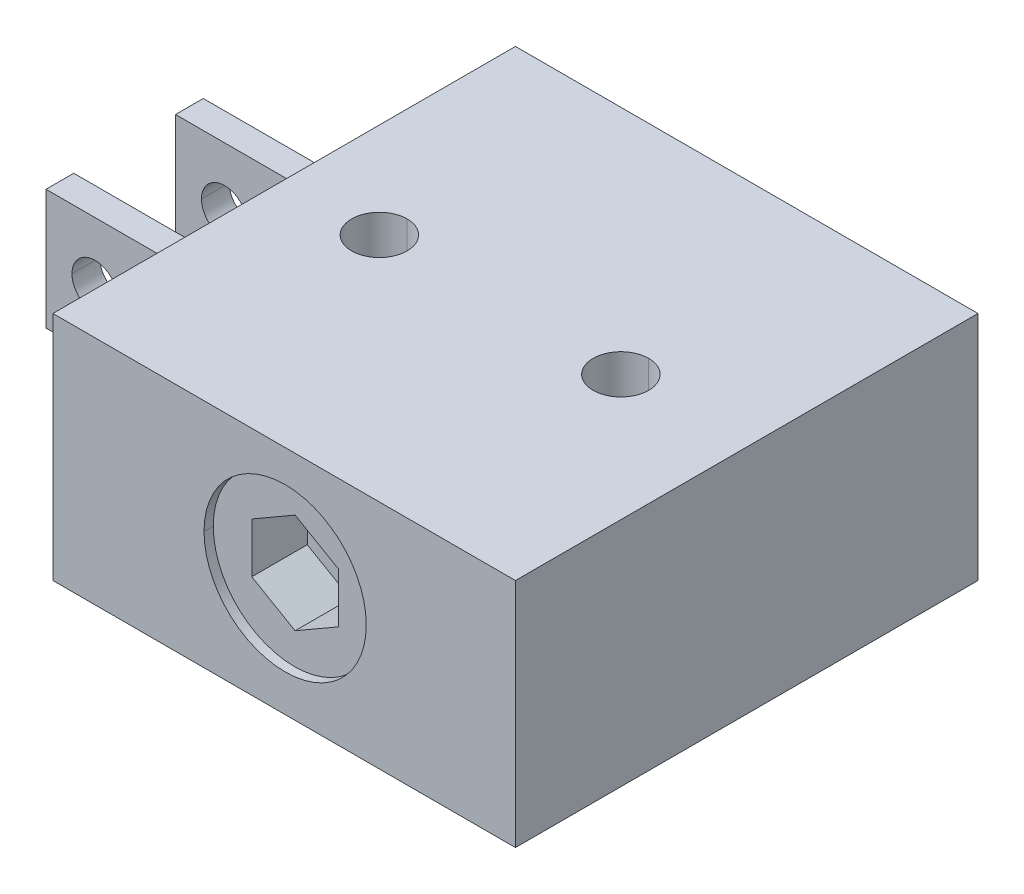
ISO-10303-21;
HEADER;
FILE_DESCRIPTION(('STEP AP214'),'2;1');
FILE_NAME('part.step','',(''),(''),'','','');
FILE_SCHEMA(('AUTOMOTIVE_DESIGN { 1 0 10303 214 1 1 1 1 }'));
ENDSEC;
DATA;
#1=APPLICATION_CONTEXT('core data for automotive mechanical design processes');
#2=APPLICATION_PROTOCOL_DEFINITION('international standard','automotive_design',2000,#1);
#3=PRODUCT_CONTEXT('',#1,'mechanical');
#4=PRODUCT('Part','Part','',(#3));
#5=PRODUCT_RELATED_PRODUCT_CATEGORY('part','',(#4));
#6=PRODUCT_DEFINITION_FORMATION('','',#4);
#7=PRODUCT_DEFINITION_CONTEXT('part definition',#1,'design');
#8=PRODUCT_DEFINITION('design','',#6,#7);
#9=PRODUCT_DEFINITION_SHAPE('','',#8);
#10=(LENGTH_UNIT() NAMED_UNIT(*) SI_UNIT(.MILLI.,.METRE.));
#11=(NAMED_UNIT(*) PLANE_ANGLE_UNIT() SI_UNIT($,.RADIAN.));
#12=(NAMED_UNIT(*) SI_UNIT($,.STERADIAN.) SOLID_ANGLE_UNIT());
#13=UNCERTAINTY_MEASURE_WITH_UNIT(LENGTH_MEASURE(1.E-05),#10,'distance_accuracy_value','');
#14=(GEOMETRIC_REPRESENTATION_CONTEXT(3) GLOBAL_UNCERTAINTY_ASSIGNED_CONTEXT((#13)) GLOBAL_UNIT_ASSIGNED_CONTEXT((#10,
#11,#12)) REPRESENTATION_CONTEXT('',''));
#15=CARTESIAN_POINT('',(0.,0.,0.));
#16=DIRECTION('',(0.,0.,1.));
#17=DIRECTION('',(1.,0.,0.));
#18=AXIS2_PLACEMENT_3D('',#15,#16,#17);
#19=CARTESIAN_POINT('',(-15.0142160341164,6.35,6.35));
#20=DIRECTION('',(0.,1.,0.));
#21=DIRECTION('',(0.,0.,1.));
#22=AXIS2_PLACEMENT_3D('',#19,#20,#21);
#23=CYLINDRICAL_SURFACE('',#22,0.762);
#24=DIRECTION('',(0.,1.,0.));
#25=VECTOR('',#24,1.);
#26=CARTESIAN_POINT('',(-15.0142160341164,6.35,5.588));
#27=LINE('',#26,#25);
#28=CARTESIAN_POINT('',(-15.0142160341164,6.35,5.588));
#29=VERTEX_POINT('',#28);
#30=CARTESIAN_POINT('',(-15.0142160341164,12.7,5.588));
#31=VERTEX_POINT('',#30);
#32=EDGE_CURVE('E337',#29,#31,#27,.T.);
#33=ORIENTED_EDGE('',*,*,#32,.F.);
#34=CARTESIAN_POINT('',(-15.0142160341164,6.35,6.35));
#35=DIRECTION('',(0.,1.,0.));
#36=DIRECTION('',(0.,0.,1.));
#37=AXIS2_PLACEMENT_3D('',#34,#35,#36);
#38=CIRCLE('',#37,0.762);
#39=CARTESIAN_POINT('',(-15.0142160341164,6.35,7.112));
#40=VERTEX_POINT('',#39);
#41=EDGE_CURVE('E413',#40,#29,#38,.T.);
#42=ORIENTED_EDGE('',*,*,#41,.F.);
#43=DIRECTION('',(0.,1.,0.));
#44=VECTOR('',#43,1.);
#45=CARTESIAN_POINT('',(-15.0142160341164,6.35,7.112));
#46=LINE('',#45,#44);
#47=CARTESIAN_POINT('',(-15.0142160341164,12.7,7.112));
#48=VERTEX_POINT('',#47);
#49=EDGE_CURVE('E359',#40,#48,#46,.T.);
#50=ORIENTED_EDGE('',*,*,#49,.T.);
#51=CARTESIAN_POINT('',(-15.0142160341164,12.7,6.35));
#52=DIRECTION('',(0.,1.,0.));
#53=DIRECTION('',(0.,0.,1.));
#54=AXIS2_PLACEMENT_3D('',#51,#52,#53);
#55=CIRCLE('',#54,0.762);
#56=EDGE_CURVE('E115',#48,#31,#55,.T.);
#57=ORIENTED_EDGE('',*,*,#56,.T.);
#58=EDGE_LOOP('',(#33,#42,#50,#57));
#59=FACE_BOUND('',#58,.T.);
#60=ADVANCED_FACE('F16',(#59),#23,.F.);
#61=CARTESIAN_POINT('',(-8.38332504879147,6.35,6.35));
#62=DIRECTION('',(0.,1.,0.));
#63=DIRECTION('',(0.,0.,1.));
#64=AXIS2_PLACEMENT_3D('',#61,#62,#63);
#65=CYLINDRICAL_SURFACE('',#64,0.762);
#66=DIRECTION('',(0.,1.,0.));
#67=VECTOR('',#66,1.);
#68=CARTESIAN_POINT('',(-8.38332504879147,6.35,5.588));
#69=LINE('',#68,#67);
#70=CARTESIAN_POINT('',(-8.38332504879147,6.35,5.588));
#71=VERTEX_POINT('',#70);
#72=CARTESIAN_POINT('',(-8.38332504879147,12.7,5.588));
#73=VERTEX_POINT('',#72);
#74=EDGE_CURVE('E371',#71,#73,#69,.T.);
#75=ORIENTED_EDGE('',*,*,#74,.F.);
#76=CARTESIAN_POINT('',(-8.38332504879147,6.35,6.35));
#77=DIRECTION('',(0.,1.,0.));
#78=DIRECTION('',(0.,0.,1.));
#79=AXIS2_PLACEMENT_3D('',#76,#77,#78);
#80=CIRCLE('',#79,0.762);
#81=CARTESIAN_POINT('',(-8.38332504879147,6.35,7.112));
#82=VERTEX_POINT('',#81);
#83=EDGE_CURVE('E99',#82,#71,#80,.T.);
#84=ORIENTED_EDGE('',*,*,#83,.F.);
#85=DIRECTION('',(0.,1.,0.));
#86=VECTOR('',#85,1.);
#87=CARTESIAN_POINT('',(-8.38332504879147,6.35,7.112));
#88=LINE('',#87,#86);
#89=CARTESIAN_POINT('',(-8.38332504879147,12.7,7.112));
#90=VERTEX_POINT('',#89);
#91=EDGE_CURVE('E307',#82,#90,#88,.T.);
#92=ORIENTED_EDGE('',*,*,#91,.T.);
#93=CARTESIAN_POINT('',(-8.38332504879147,12.7,6.35));
#94=DIRECTION('',(0.,1.,0.));
#95=DIRECTION('',(0.,0.,1.));
#96=AXIS2_PLACEMENT_3D('',#93,#94,#95);
#97=CIRCLE('',#96,0.762);
#98=EDGE_CURVE('E354',#90,#73,#97,.T.);
#99=ORIENTED_EDGE('',*,*,#98,.T.);
#100=EDGE_LOOP('',(#75,#84,#92,#99));
#101=FACE_BOUND('',#100,.T.);
#102=ADVANCED_FACE('F946',(#101),#65,.F.);
#103=CARTESIAN_POINT('',(-10.0410788200446,10.2899936535945,10.922));
#104=DIRECTION('',(0.5,0.866025403784438,0.));
#105=DIRECTION('',(0.,0.,-1.));
#106=AXIS2_PLACEMENT_3D('',#103,#104,#105);
#107=PLANE('',#106);
#108=DIRECTION('',(0.866025403784438,-0.5,0.));
#109=VECTOR('',#108,1.);
#110=CARTESIAN_POINT('',(-10.0410788200446,10.2899936535945,12.446));
#111=LINE('',#110,#109);
#112=CARTESIAN_POINT('',(-11.2317038200446,10.9774013178484,12.446));
#113=VERTEX_POINT('',#112);
#114=CARTESIAN_POINT('',(-10.0410788200446,10.2899936535945,12.446));
#115=VERTEX_POINT('',#114);
#116=EDGE_CURVE('E294',#113,#115,#111,.T.);
#117=ORIENTED_EDGE('',*,*,#116,.F.);
#118=DIRECTION('',(0.,0.,1.));
#119=VECTOR('',#118,1.);
#120=CARTESIAN_POINT('',(-11.2317038200446,10.9774013178484,10.922));
#121=LINE('',#120,#119);
#122=CARTESIAN_POINT('',(-11.2317038200446,10.9774013178484,10.922));
#123=VERTEX_POINT('',#122);
#124=EDGE_CURVE('E344',#123,#113,#121,.T.);
#125=ORIENTED_EDGE('',*,*,#124,.F.);
#126=DIRECTION('',(-0.866025403784438,0.5,0.));
#127=VECTOR('',#126,1.);
#128=CARTESIAN_POINT('',(-10.0410788200446,10.2899936535945,10.922));
#129=LINE('',#128,#127);
#130=CARTESIAN_POINT('',(-10.0410788200446,10.2899936535945,10.922));
#131=VERTEX_POINT('',#130);
#132=EDGE_CURVE('E332',#131,#123,#129,.T.);
#133=ORIENTED_EDGE('',*,*,#132,.F.);
#134=DIRECTION('',(0.,0.,1.));
#135=VECTOR('',#134,1.);
#136=CARTESIAN_POINT('',(-10.0410788200446,10.2899936535945,10.922));
#137=LINE('',#136,#135);
#138=EDGE_CURVE('E11',#131,#115,#137,.T.);
#139=ORIENTED_EDGE('',*,*,#138,.T.);
#140=EDGE_LOOP('',(#117,#125,#133,#139));
#141=FACE_BOUND('',#140,.T.);
#142=ADVANCED_FACE('F950',(#141),#107,.F.);
#143=CARTESIAN_POINT('',(-10.0410788200446,8.91517832508675,10.922));
#144=DIRECTION('',(1.,0.,0.));
#145=DIRECTION('',(0.,1.,0.));
#146=AXIS2_PLACEMENT_3D('',#143,#144,#145);
#147=PLANE('',#146);
#148=DIRECTION('',(0.,-1.,0.));
#149=VECTOR('',#148,1.);
#150=CARTESIAN_POINT('',(-10.0410788200446,8.91517832508675,12.446));
#151=LINE('',#150,#149);
#152=CARTESIAN_POINT('',(-10.0410788200446,8.91517832508675,12.446));
#153=VERTEX_POINT('',#152);
#154=EDGE_CURVE('E427',#115,#153,#151,.T.);
#155=ORIENTED_EDGE('',*,*,#154,.F.);
#156=ORIENTED_EDGE('',*,*,#138,.F.);
#157=DIRECTION('',(0.,1.,0.));
#158=VECTOR('',#157,1.);
#159=CARTESIAN_POINT('',(-10.0410788200446,8.91517832508675,10.922));
#160=LINE('',#159,#158);
#161=CARTESIAN_POINT('',(-10.0410788200446,8.91517832508675,10.922));
#162=VERTEX_POINT('',#161);
#163=EDGE_CURVE('E20',#162,#131,#160,.T.);
#164=ORIENTED_EDGE('',*,*,#163,.F.);
#165=DIRECTION('',(0.,0.,1.));
#166=VECTOR('',#165,1.);
#167=CARTESIAN_POINT('',(-10.0410788200446,8.91517832508675,10.922));
#168=LINE('',#167,#166);
#169=EDGE_CURVE('E27',#162,#153,#168,.T.);
#170=ORIENTED_EDGE('',*,*,#169,.T.);
#171=EDGE_LOOP('',(#155,#156,#164,#170));
#172=FACE_BOUND('',#171,.T.);
#173=ADVANCED_FACE('F875',(#172),#147,.F.);
#174=CARTESIAN_POINT('',(-11.2317038200446,8.22777066083285,10.922));
#175=DIRECTION('',(0.5,-0.866025403784439,0.));
#176=DIRECTION('',(0.,0.,-1.));
#177=AXIS2_PLACEMENT_3D('',#174,#175,#176);
#178=PLANE('',#177);
#179=DIRECTION('',(-0.866025403784438,-0.5,0.));
#180=VECTOR('',#179,1.);
#181=CARTESIAN_POINT('',(-11.2317038200446,8.22777066083285,12.446));
#182=LINE('',#181,#180);
#183=CARTESIAN_POINT('',(-11.2317038200446,8.22777066083285,12.446));
#184=VERTEX_POINT('',#183);
#185=EDGE_CURVE('E382',#153,#184,#182,.T.);
#186=ORIENTED_EDGE('',*,*,#185,.F.);
#187=ORIENTED_EDGE('',*,*,#169,.F.);
#188=DIRECTION('',(0.866025403784439,0.5,0.));
#189=VECTOR('',#188,1.);
#190=CARTESIAN_POINT('',(-11.2317038200446,8.22777066083285,10.922));
#191=LINE('',#190,#189);
#192=CARTESIAN_POINT('',(-11.2317038200446,8.22777066083285,10.922));
#193=VERTEX_POINT('',#192);
#194=EDGE_CURVE('E456',#193,#162,#191,.T.);
#195=ORIENTED_EDGE('',*,*,#194,.F.);
#196=DIRECTION('',(0.,0.,1.));
#197=VECTOR('',#196,1.);
#198=CARTESIAN_POINT('',(-11.2317038200446,8.22777066083285,10.922));
#199=LINE('',#198,#197);
#200=EDGE_CURVE('E493',#193,#184,#199,.T.);
#201=ORIENTED_EDGE('',*,*,#200,.T.);
#202=EDGE_LOOP('',(#186,#187,#195,#201));
#203=FACE_BOUND('',#202,.T.);
#204=ADVANCED_FACE('F870',(#203),#178,.F.);
#205=CARTESIAN_POINT('',(-12.4223288200446,8.91517832508675,10.922));
#206=DIRECTION('',(-0.5,-0.866025403784439,0.));
#207=DIRECTION('',(-0.866025403784439,0.5,0.));
#208=AXIS2_PLACEMENT_3D('',#205,#206,#207);
#209=PLANE('',#208);
#210=DIRECTION('',(-0.866025403784439,0.5,0.));
#211=VECTOR('',#210,1.);
#212=CARTESIAN_POINT('',(-12.4223288200446,8.91517832508675,12.446));
#213=LINE('',#212,#211);
#214=CARTESIAN_POINT('',(-12.4223288200446,8.91517832508675,12.446));
#215=VERTEX_POINT('',#214);
#216=EDGE_CURVE('E469',#184,#215,#213,.T.);
#217=ORIENTED_EDGE('',*,*,#216,.F.);
#218=ORIENTED_EDGE('',*,*,#200,.F.);
#219=DIRECTION('',(0.866025403784439,-0.5,0.));
#220=VECTOR('',#219,1.);
#221=CARTESIAN_POINT('',(-12.4223288200446,8.91517832508675,10.922));
#222=LINE('',#221,#220);
#223=CARTESIAN_POINT('',(-12.4223288200446,8.91517832508675,10.922));
#224=VERTEX_POINT('',#223);
#225=EDGE_CURVE('E452',#224,#193,#222,.T.);
#226=ORIENTED_EDGE('',*,*,#225,.F.);
#227=DIRECTION('',(0.,0.,1.));
#228=VECTOR('',#227,1.);
#229=CARTESIAN_POINT('',(-12.4223288200446,8.91517832508675,10.922));
#230=LINE('',#229,#228);
#231=EDGE_CURVE('E489',#224,#215,#230,.T.);
#232=ORIENTED_EDGE('',*,*,#231,.T.);
#233=EDGE_LOOP('',(#217,#218,#226,#232));
#234=FACE_BOUND('',#233,.T.);
#235=ADVANCED_FACE('F874',(#234),#209,.F.);
#236=CARTESIAN_POINT('',(-12.4223288200446,10.2899936535945,10.922));
#237=DIRECTION('',(-1.,0.,0.));
#238=DIRECTION('',(0.,0.,1.));
#239=AXIS2_PLACEMENT_3D('',#236,#237,#238);
#240=PLANE('',#239);
#241=DIRECTION('',(0.,1.,0.));
#242=VECTOR('',#241,1.);
#243=CARTESIAN_POINT('',(-12.4223288200446,10.2899936535945,12.446));
#244=LINE('',#243,#242);
#245=CARTESIAN_POINT('',(-12.4223288200446,10.2899936535945,12.446));
#246=VERTEX_POINT('',#245);
#247=EDGE_CURVE('E387',#215,#246,#244,.T.);
#248=ORIENTED_EDGE('',*,*,#247,.F.);
#249=ORIENTED_EDGE('',*,*,#231,.F.);
#250=DIRECTION('',(0.,-1.,0.));
#251=VECTOR('',#250,1.);
#252=CARTESIAN_POINT('',(-12.4223288200446,10.2899936535945,10.922));
#253=LINE('',#252,#251);
#254=CARTESIAN_POINT('',(-12.4223288200446,10.2899936535945,10.922));
#255=VERTEX_POINT('',#254);
#256=EDGE_CURVE('E331',#255,#224,#253,.T.);
#257=ORIENTED_EDGE('',*,*,#256,.F.);
#258=DIRECTION('',(0.,0.,1.));
#259=VECTOR('',#258,1.);
#260=CARTESIAN_POINT('',(-12.4223288200446,10.2899936535945,10.922));
#261=LINE('',#260,#259);
#262=EDGE_CURVE('E341',#255,#246,#261,.T.);
#263=ORIENTED_EDGE('',*,*,#262,.T.);
#264=EDGE_LOOP('',(#248,#249,#257,#263));
#265=FACE_BOUND('',#264,.T.);
#266=ADVANCED_FACE('F933',(#265),#240,.F.);
#267=CARTESIAN_POINT('',(-11.2317038200446,10.9774013178484,10.922));
#268=DIRECTION('',(-0.5,0.866025403784439,0.));
#269=DIRECTION('',(0.,0.,1.));
#270=AXIS2_PLACEMENT_3D('',#267,#268,#269);
#271=PLANE('',#270);
#272=DIRECTION('',(0.866025403784439,0.5,0.));
#273=VECTOR('',#272,1.);
#274=CARTESIAN_POINT('',(-11.2317038200446,10.9774013178484,12.446));
#275=LINE('',#274,#273);
#276=EDGE_CURVE('E384',#246,#113,#275,.T.);
#277=ORIENTED_EDGE('',*,*,#276,.F.);
#278=ORIENTED_EDGE('',*,*,#262,.F.);
#279=DIRECTION('',(-0.866025403784439,-0.5,0.));
#280=VECTOR('',#279,1.);
#281=CARTESIAN_POINT('',(-11.2317038200446,10.9774013178484,10.922));
#282=LINE('',#281,#280);
#283=EDGE_CURVE('E327',#123,#255,#282,.T.);
#284=ORIENTED_EDGE('',*,*,#283,.F.);
#285=ORIENTED_EDGE('',*,*,#124,.T.);
#286=EDGE_LOOP('',(#277,#278,#284,#285));
#287=FACE_BOUND('',#286,.T.);
#288=ADVANCED_FACE('F937',(#287),#271,.F.);
#289=CARTESIAN_POINT('',(0.,0.,10.922));
#290=DIRECTION('',(0.,0.,1.));
#291=DIRECTION('',(1.,0.,0.));
#292=AXIS2_PLACEMENT_3D('',#289,#290,#291);
#293=PLANE('',#292);
#294=ORIENTED_EDGE('',*,*,#132,.T.);
#295=ORIENTED_EDGE('',*,*,#283,.T.);
#296=ORIENTED_EDGE('',*,*,#256,.T.);
#297=ORIENTED_EDGE('',*,*,#225,.T.);
#298=ORIENTED_EDGE('',*,*,#194,.T.);
#299=ORIENTED_EDGE('',*,*,#163,.T.);
#300=EDGE_LOOP('',(#294,#295,#296,#297,#298,#299));
#301=FACE_BOUND('',#300,.T.);
#302=ADVANCED_FACE('F973',(#301),#293,.T.);
#303=CARTESIAN_POINT('',(-11.2518609609383,9.59255609938031,12.446));
#304=DIRECTION('',(0.,0.,1.));
#305=DIRECTION('',(1.,0.,0.));
#306=AXIS2_PLACEMENT_3D('',#303,#304,#305);
#307=CYLINDRICAL_SURFACE('',#306,2.22699398855566);
#308=DIRECTION('',(0.,0.,1.));
#309=VECTOR('',#308,1.);
#310=CARTESIAN_POINT('',(-13.478854949494,9.59255609938031,12.446));
#311=LINE('',#310,#309);
#312=CARTESIAN_POINT('',(-13.478854949494,9.59255609938031,12.446));
#313=VERTEX_POINT('',#312);
#314=CARTESIAN_POINT('',(-13.478854949494,9.59255609938031,12.7));
#315=VERTEX_POINT('',#314);
#316=EDGE_CURVE('E289',#313,#315,#311,.T.);
#317=ORIENTED_EDGE('',*,*,#316,.F.);
#318=CARTESIAN_POINT('',(-11.2518609609383,9.59255609938031,12.446));
#319=DIRECTION('',(0.,0.,1.));
#320=DIRECTION('',(1.,0.,0.));
#321=AXIS2_PLACEMENT_3D('',#318,#319,#320);
#322=CIRCLE('',#321,2.22699398855566);
#323=CARTESIAN_POINT('',(-9.02486697238265,9.59255609938031,12.446));
#324=VERTEX_POINT('',#323);
#325=EDGE_CURVE('E283',#324,#313,#322,.T.);
#326=ORIENTED_EDGE('',*,*,#325,.F.);
#327=DIRECTION('',(0.,0.,1.));
#328=VECTOR('',#327,1.);
#329=CARTESIAN_POINT('',(-9.02486697238265,9.59255609938031,12.446));
#330=LINE('',#329,#328);
#331=CARTESIAN_POINT('',(-9.02486697238265,9.59255609938031,12.7));
#332=VERTEX_POINT('',#331);
#333=EDGE_CURVE('E286',#324,#332,#330,.T.);
#334=ORIENTED_EDGE('',*,*,#333,.T.);
#335=CARTESIAN_POINT('',(-11.2518609609383,9.59255609938031,12.7));
#336=DIRECTION('',(0.,0.,1.));
#337=DIRECTION('',(1.,0.,0.));
#338=AXIS2_PLACEMENT_3D('',#335,#336,#337);
#339=CIRCLE('',#338,2.22699398855566);
#340=EDGE_CURVE('E350',#332,#315,#339,.T.);
#341=ORIENTED_EDGE('',*,*,#340,.T.);
#342=EDGE_LOOP('',(#317,#326,#334,#341));
#343=FACE_BOUND('',#342,.T.);
#344=ADVANCED_FACE('F285',(#343),#307,.F.);
#345=CARTESIAN_POINT('',(-11.2518609609383,9.59255609938031,12.446));
#346=DIRECTION('',(0.,0.,1.));
#347=DIRECTION('',(1.,0.,0.));
#348=AXIS2_PLACEMENT_3D('',#345,#346,#347);
#349=PLANE('',#348);
#350=ORIENTED_EDGE('',*,*,#116,.T.);
#351=ORIENTED_EDGE('',*,*,#154,.T.);
#352=ORIENTED_EDGE('',*,*,#185,.T.);
#353=ORIENTED_EDGE('',*,*,#216,.T.);
#354=ORIENTED_EDGE('',*,*,#247,.T.);
#355=ORIENTED_EDGE('',*,*,#276,.T.);
#356=EDGE_LOOP('',(#350,#351,#352,#353,#354,#355));
#357=FACE_BOUND('',#356,.T.);
#358=ORIENTED_EDGE('',*,*,#325,.T.);
#359=CARTESIAN_POINT('',(-11.2518609609383,9.59255609938031,12.446));
#360=DIRECTION('',(0.,0.,1.));
#361=DIRECTION('',(1.,0.,0.));
#362=AXIS2_PLACEMENT_3D('',#359,#360,#361);
#363=CIRCLE('',#362,2.22699398855566);
#364=EDGE_CURVE('E299',#313,#324,#363,.T.);
#365=ORIENTED_EDGE('',*,*,#364,.T.);
#366=EDGE_LOOP('',(#358,#365));
#367=FACE_BOUND('',#366,.T.);
#368=ADVANCED_FACE('F305',(#357,#367),#349,.T.);
#369=CARTESIAN_POINT('',(-20.8526450796778,9.525,0.));
#370=DIRECTION('',(0.,0.,1.));
#371=DIRECTION('',(1.,0.,0.));
#372=AXIS2_PLACEMENT_3D('',#369,#370,#371);
#373=CYLINDRICAL_SURFACE('',#372,0.635);
#374=DIRECTION('',(0.,0.,1.));
#375=VECTOR('',#374,1.);
#376=CARTESIAN_POINT('',(-21.4876450796779,9.525,0.));
#377=LINE('',#376,#375);
#378=CARTESIAN_POINT('',(-21.4876450796779,9.525,3.99919577824115));
#379=VERTEX_POINT('',#378);
#380=CARTESIAN_POINT('',(-21.4876450796779,9.525,4.76119577824115));
#381=VERTEX_POINT('',#380);
#382=EDGE_CURVE('E441',#379,#381,#377,.T.);
#383=ORIENTED_EDGE('',*,*,#382,.F.);
#384=CARTESIAN_POINT('',(-20.8526450796778,9.525,3.99919577824115));
#385=DIRECTION('',(0.,0.,1.));
#386=DIRECTION('',(1.,0.,0.));
#387=AXIS2_PLACEMENT_3D('',#384,#385,#386);
#388=CIRCLE('',#387,0.635);
#389=CARTESIAN_POINT('',(-20.2176450796779,9.525,3.99919577824115));
#390=VERTEX_POINT('',#389);
#391=EDGE_CURVE('E325',#390,#379,#388,.T.);
#392=ORIENTED_EDGE('',*,*,#391,.F.);
#393=DIRECTION('',(0.,0.,1.));
#394=VECTOR('',#393,1.);
#395=CARTESIAN_POINT('',(-20.2176450796779,9.525,0.));
#396=LINE('',#395,#394);
#397=CARTESIAN_POINT('',(-20.2176450796779,9.525,4.76119577824115));
#398=VERTEX_POINT('',#397);
#399=EDGE_CURVE('E473',#390,#398,#396,.T.);
#400=ORIENTED_EDGE('',*,*,#399,.T.);
#401=CARTESIAN_POINT('',(-20.8526450796778,9.525,4.76119577824115));
#402=DIRECTION('',(0.,0.,-1.));
#403=DIRECTION('',(0.,1.,0.));
#404=AXIS2_PLACEMENT_3D('',#401,#402,#403);
#405=CIRCLE('',#404,0.635);
#406=EDGE_CURVE('E401',#381,#398,#405,.T.);
#407=ORIENTED_EDGE('',*,*,#406,.F.);
#408=EDGE_LOOP('',(#383,#392,#400,#407));
#409=FACE_BOUND('',#408,.T.);
#410=ADVANCED_FACE('F1102',(#409),#373,.F.);
#411=CARTESIAN_POINT('',(-20.8526450796778,9.525,0.));
#412=DIRECTION('',(0.,0.,1.));
#413=DIRECTION('',(1.,0.,0.));
#414=AXIS2_PLACEMENT_3D('',#411,#412,#413);
#415=CYLINDRICAL_SURFACE('',#414,0.635);
#416=DIRECTION('',(0.,0.,1.));
#417=VECTOR('',#416,1.);
#418=CARTESIAN_POINT('',(-21.4876450796779,9.525,0.));
#419=LINE('',#418,#417);
#420=CARTESIAN_POINT('',(-21.4876450796779,9.525,7.55519577824115));
#421=VERTEX_POINT('',#420);
#422=CARTESIAN_POINT('',(-21.4876450796779,9.525,8.31719577824115));
#423=VERTEX_POINT('',#422);
#424=EDGE_CURVE('E403',#421,#423,#419,.T.);
#425=ORIENTED_EDGE('',*,*,#424,.F.);
#426=CARTESIAN_POINT('',(-20.8526450796778,9.525,7.55519577824115));
#427=DIRECTION('',(0.,0.,1.));
#428=DIRECTION('',(1.,0.,0.));
#429=AXIS2_PLACEMENT_3D('',#426,#427,#428);
#430=CIRCLE('',#429,0.635);
#431=CARTESIAN_POINT('',(-20.2176450796779,9.525,7.55519577824115));
#432=VERTEX_POINT('',#431);
#433=EDGE_CURVE('E156',#432,#421,#430,.T.);
#434=ORIENTED_EDGE('',*,*,#433,.F.);
#435=DIRECTION('',(0.,0.,1.));
#436=VECTOR('',#435,1.);
#437=CARTESIAN_POINT('',(-20.2176450796779,9.525,0.));
#438=LINE('',#437,#436);
#439=CARTESIAN_POINT('',(-20.2176450796779,9.525,8.31719577824115));
#440=VERTEX_POINT('',#439);
#441=EDGE_CURVE('E393',#432,#440,#438,.T.);
#442=ORIENTED_EDGE('',*,*,#441,.T.);
#443=CARTESIAN_POINT('',(-20.8526450796778,9.525,8.31719577824115));
#444=DIRECTION('',(0.,0.,-1.));
#445=DIRECTION('',(0.,1.,0.));
#446=AXIS2_PLACEMENT_3D('',#443,#444,#445);
#447=CIRCLE('',#446,0.635);
#448=EDGE_CURVE('E145',#423,#440,#447,.T.);
#449=ORIENTED_EDGE('',*,*,#448,.F.);
#450=EDGE_LOOP('',(#425,#434,#442,#449));
#451=FACE_BOUND('',#450,.T.);
#452=ADVANCED_FACE('F924',(#451),#415,.F.);
#453=CARTESIAN_POINT('',(-22.2003582089552,0.,0.));
#454=DIRECTION('',(-1.,0.,0.));
#455=DIRECTION('',(0.,0.,1.));
#456=AXIS2_PLACEMENT_3D('',#453,#454,#455);
#457=PLANE('',#456);
#458=DIRECTION('',(0.,-1.,0.));
#459=VECTOR('',#458,1.);
#460=CARTESIAN_POINT('',(-22.2003582089552,11.176,7.55519577824115));
#461=LINE('',#460,#459);
#462=CARTESIAN_POINT('',(-22.2003582089552,11.176,7.55519577824115));
#463=VERTEX_POINT('',#462);
#464=CARTESIAN_POINT('',(-22.2003582089552,7.874,7.55519577824115));
#465=VERTEX_POINT('',#464);
#466=EDGE_CURVE('E423',#463,#465,#461,.T.);
#467=ORIENTED_EDGE('',*,*,#466,.T.);
#468=DIRECTION('',(0.,0.,1.));
#469=VECTOR('',#468,1.);
#470=CARTESIAN_POINT('',(-22.2003582089552,7.874,7.55519577824115));
#471=LINE('',#470,#469);
#472=CARTESIAN_POINT('',(-22.2003582089552,7.874,8.31719577824115));
#473=VERTEX_POINT('',#472);
#474=EDGE_CURVE('E422',#465,#473,#471,.T.);
#475=ORIENTED_EDGE('',*,*,#474,.T.);
#476=DIRECTION('',(0.,1.,0.));
#477=VECTOR('',#476,1.);
#478=CARTESIAN_POINT('',(-22.2003582089552,11.176,8.31719577824115));
#479=LINE('',#478,#477);
#480=CARTESIAN_POINT('',(-22.2003582089552,11.176,8.31719577824115));
#481=VERTEX_POINT('',#480);
#482=EDGE_CURVE('E480',#473,#481,#479,.T.);
#483=ORIENTED_EDGE('',*,*,#482,.T.);
#484=DIRECTION('',(0.,0.,-1.));
#485=VECTOR('',#484,1.);
#486=CARTESIAN_POINT('',(-22.2003582089552,11.176,7.55519577824115));
#487=LINE('',#486,#485);
#488=EDGE_CURVE('E295',#481,#463,#487,.T.);
#489=ORIENTED_EDGE('',*,*,#488,.T.);
#490=EDGE_LOOP('',(#467,#475,#483,#489));
#491=FACE_BOUND('',#490,.T.);
#492=ADVANCED_FACE('F920',(#491),#457,.T.);
#493=CARTESIAN_POINT('',(-22.2003582089552,11.176,7.55519577824115));
#494=DIRECTION('',(0.,-1.,0.));
#495=DIRECTION('',(0.,0.,-1.));
#496=AXIS2_PLACEMENT_3D('',#493,#494,#495);
#497=PLANE('',#496);
#498=DIRECTION('',(0.,0.,-1.));
#499=VECTOR('',#498,1.);
#500=CARTESIAN_POINT('',(-17.6283582089552,11.176,7.55519577824115));
#501=LINE('',#500,#499);
#502=CARTESIAN_POINT('',(-17.6283582089552,11.176,8.31719577824115));
#503=VERTEX_POINT('',#502);
#504=CARTESIAN_POINT('',(-17.6283582089552,11.176,7.55519577824115));
#505=VERTEX_POINT('',#504);
#506=EDGE_CURVE('E357',#503,#505,#501,.T.);
#507=ORIENTED_EDGE('',*,*,#506,.T.);
#508=DIRECTION('',(1.,0.,0.));
#509=VECTOR('',#508,1.);
#510=CARTESIAN_POINT('',(-22.2003582089552,11.176,7.55519577824115));
#511=LINE('',#510,#509);
#512=EDGE_CURVE('E242',#463,#505,#511,.T.);
#513=ORIENTED_EDGE('',*,*,#512,.F.);
#514=ORIENTED_EDGE('',*,*,#488,.F.);
#515=DIRECTION('',(1.,0.,0.));
#516=VECTOR('',#515,1.);
#517=CARTESIAN_POINT('',(-22.2003582089552,11.176,8.31719577824115));
#518=LINE('',#517,#516);
#519=EDGE_CURVE('E449',#481,#503,#518,.T.);
#520=ORIENTED_EDGE('',*,*,#519,.T.);
#521=EDGE_LOOP('',(#507,#513,#514,#520));
#522=FACE_BOUND('',#521,.T.);
#523=ADVANCED_FACE('F574',(#522),#497,.F.);
#524=CARTESIAN_POINT('',(-22.2003582089552,11.176,8.31719577824115));
#525=DIRECTION('',(0.,0.,-1.));
#526=DIRECTION('',(0.,-1.,0.));
#527=AXIS2_PLACEMENT_3D('',#524,#525,#526);
#528=PLANE('',#527);
#529=CARTESIAN_POINT('',(-20.8526450796778,9.525,8.31719577824115));
#530=DIRECTION('',(0.,0.,-1.));
#531=DIRECTION('',(0.,1.,0.));
#532=AXIS2_PLACEMENT_3D('',#529,#530,#531);
#533=CIRCLE('',#532,0.635);
#534=EDGE_CURVE('E407',#440,#423,#533,.T.);
#535=ORIENTED_EDGE('',*,*,#534,.T.);
#536=ORIENTED_EDGE('',*,*,#448,.T.);
#537=EDGE_LOOP('',(#535,#536));
#538=FACE_BOUND('',#537,.T.);
#539=DIRECTION('',(0.,1.,0.));
#540=VECTOR('',#539,1.);
#541=CARTESIAN_POINT('',(-17.6283582089552,11.176,8.31719577824115));
#542=LINE('',#541,#540);
#543=CARTESIAN_POINT('',(-17.6283582089552,7.874,8.31719577824115));
#544=VERTEX_POINT('',#543);
#545=EDGE_CURVE('E508',#544,#503,#542,.T.);
#546=ORIENTED_EDGE('',*,*,#545,.T.);
#547=ORIENTED_EDGE('',*,*,#519,.F.);
#548=ORIENTED_EDGE('',*,*,#482,.F.);
#549=DIRECTION('',(1.,0.,0.));
#550=VECTOR('',#549,1.);
#551=CARTESIAN_POINT('',(-22.2003582089552,7.874,8.31719577824115));
#552=LINE('',#551,#550);
#553=EDGE_CURVE('E418',#473,#544,#552,.T.);
#554=ORIENTED_EDGE('',*,*,#553,.T.);
#555=EDGE_LOOP('',(#546,#547,#548,#554));
#556=FACE_BOUND('',#555,.T.);
#557=ADVANCED_FACE('F580',(#538,#556),#528,.F.);
#558=CARTESIAN_POINT('',(-22.2003582089552,7.874,7.55519577824115));
#559=DIRECTION('',(0.,1.,0.));
#560=DIRECTION('',(0.,0.,-1.));
#561=AXIS2_PLACEMENT_3D('',#558,#559,#560);
#562=PLANE('',#561);
#563=DIRECTION('',(0.,0.,1.));
#564=VECTOR('',#563,1.);
#565=CARTESIAN_POINT('',(-17.6283582089552,7.874,7.55519577824115));
#566=LINE('',#565,#564);
#567=CARTESIAN_POINT('',(-17.6283582089552,7.874,7.55519577824115));
#568=VERTEX_POINT('',#567);
#569=EDGE_CURVE('E504',#568,#544,#566,.T.);
#570=ORIENTED_EDGE('',*,*,#569,.T.);
#571=ORIENTED_EDGE('',*,*,#553,.F.);
#572=ORIENTED_EDGE('',*,*,#474,.F.);
#573=DIRECTION('',(1.,0.,0.));
#574=VECTOR('',#573,1.);
#575=CARTESIAN_POINT('',(-22.2003582089552,7.874,7.55519577824115));
#576=LINE('',#575,#574);
#577=EDGE_CURVE('E229',#465,#568,#576,.T.);
#578=ORIENTED_EDGE('',*,*,#577,.T.);
#579=EDGE_LOOP('',(#570,#571,#572,#578));
#580=FACE_BOUND('',#579,.T.);
#581=ADVANCED_FACE('F909',(#580),#562,.F.);
#582=CARTESIAN_POINT('',(-22.2003582089552,11.176,7.55519577824115));
#583=DIRECTION('',(0.,0.,1.));
#584=DIRECTION('',(1.,0.,0.));
#585=AXIS2_PLACEMENT_3D('',#582,#583,#584);
#586=PLANE('',#585);
#587=ORIENTED_EDGE('',*,*,#433,.T.);
#588=CARTESIAN_POINT('',(-20.8526450796778,9.525,7.55519577824115));
#589=DIRECTION('',(0.,0.,1.));
#590=DIRECTION('',(1.,0.,0.));
#591=AXIS2_PLACEMENT_3D('',#588,#589,#590);
#592=CIRCLE('',#591,0.635);
#593=EDGE_CURVE('E408',#421,#432,#592,.T.);
#594=ORIENTED_EDGE('',*,*,#593,.T.);
#595=EDGE_LOOP('',(#587,#594));
#596=FACE_BOUND('',#595,.T.);
#597=DIRECTION('',(0.,-1.,0.));
#598=VECTOR('',#597,1.);
#599=CARTESIAN_POINT('',(-17.6283582089552,11.176,7.55519577824115));
#600=LINE('',#599,#598);
#601=EDGE_CURVE('E355',#505,#568,#600,.T.);
#602=ORIENTED_EDGE('',*,*,#601,.T.);
#603=ORIENTED_EDGE('',*,*,#577,.F.);
#604=ORIENTED_EDGE('',*,*,#466,.F.);
#605=ORIENTED_EDGE('',*,*,#512,.T.);
#606=EDGE_LOOP('',(#602,#603,#604,#605));
#607=FACE_BOUND('',#606,.T.);
#608=ADVANCED_FACE('F587',(#596,#607),#586,.F.);
#609=CARTESIAN_POINT('',(-22.2003582089552,0.,0.));
#610=DIRECTION('',(-1.,0.,0.));
#611=DIRECTION('',(0.,0.,1.));
#612=AXIS2_PLACEMENT_3D('',#609,#610,#611);
#613=PLANE('',#612);
#614=DIRECTION('',(0.,-1.,0.));
#615=VECTOR('',#614,1.);
#616=CARTESIAN_POINT('',(-22.2003582089552,11.176,3.99919577824115));
#617=LINE('',#616,#615);
#618=CARTESIAN_POINT('',(-22.2003582089552,11.176,3.99919577824115));
#619=VERTEX_POINT('',#618);
#620=CARTESIAN_POINT('',(-22.2003582089552,7.874,3.99919577824115));
#621=VERTEX_POINT('',#620);
#622=EDGE_CURVE('E326',#619,#621,#617,.T.);
#623=ORIENTED_EDGE('',*,*,#622,.T.);
#624=DIRECTION('',(0.,0.,1.));
#625=VECTOR('',#624,1.);
#626=CARTESIAN_POINT('',(-22.2003582089552,7.874,3.99919577824115));
#627=LINE('',#626,#625);
#628=CARTESIAN_POINT('',(-22.2003582089552,7.874,4.76119577824115));
#629=VERTEX_POINT('',#628);
#630=EDGE_CURVE('E189',#621,#629,#627,.T.);
#631=ORIENTED_EDGE('',*,*,#630,.T.);
#632=DIRECTION('',(0.,1.,0.));
#633=VECTOR('',#632,1.);
#634=CARTESIAN_POINT('',(-22.2003582089552,11.176,4.76119577824115));
#635=LINE('',#634,#633);
#636=CARTESIAN_POINT('',(-22.2003582089552,11.176,4.76119577824115));
#637=VERTEX_POINT('',#636);
#638=EDGE_CURVE('E397',#629,#637,#635,.T.);
#639=ORIENTED_EDGE('',*,*,#638,.T.);
#640=DIRECTION('',(0.,0.,-1.));
#641=VECTOR('',#640,1.);
#642=CARTESIAN_POINT('',(-22.2003582089552,11.176,3.99919577824115));
#643=LINE('',#642,#641);
#644=EDGE_CURVE('E415',#637,#619,#643,.T.);
#645=ORIENTED_EDGE('',*,*,#644,.T.);
#646=EDGE_LOOP('',(#623,#631,#639,#645));
#647=FACE_BOUND('',#646,.T.);
#648=ADVANCED_FACE('F900',(#647),#613,.T.);
#649=CARTESIAN_POINT('',(-22.2003582089552,11.176,3.99919577824115));
#650=DIRECTION('',(0.,-1.,0.));
#651=DIRECTION('',(0.,0.,-1.));
#652=AXIS2_PLACEMENT_3D('',#649,#650,#651);
#653=PLANE('',#652);
#654=DIRECTION('',(0.,0.,-1.));
#655=VECTOR('',#654,1.);
#656=CARTESIAN_POINT('',(-17.6283582089552,11.176,3.99919577824115));
#657=LINE('',#656,#655);
#658=CARTESIAN_POINT('',(-17.6283582089552,11.176,4.76119577824115));
#659=VERTEX_POINT('',#658);
#660=CARTESIAN_POINT('',(-17.6283582089552,11.176,3.99919577824115));
#661=VERTEX_POINT('',#660);
#662=EDGE_CURVE('E433',#659,#661,#657,.T.);
#663=ORIENTED_EDGE('',*,*,#662,.T.);
#664=DIRECTION('',(1.,0.,0.));
#665=VECTOR('',#664,1.);
#666=CARTESIAN_POINT('',(-22.2003582089552,11.176,3.99919577824115));
#667=LINE('',#666,#665);
#668=EDGE_CURVE('E321',#619,#661,#667,.T.);
#669=ORIENTED_EDGE('',*,*,#668,.F.);
#670=ORIENTED_EDGE('',*,*,#644,.F.);
#671=DIRECTION('',(1.,0.,0.));
#672=VECTOR('',#671,1.);
#673=CARTESIAN_POINT('',(-22.2003582089552,11.176,4.76119577824115));
#674=LINE('',#673,#672);
#675=EDGE_CURVE('E402',#637,#659,#674,.T.);
#676=ORIENTED_EDGE('',*,*,#675,.T.);
#677=EDGE_LOOP('',(#663,#669,#670,#676));
#678=FACE_BOUND('',#677,.T.);
#679=ADVANCED_FACE('F895',(#678),#653,.F.);
#680=CARTESIAN_POINT('',(-22.2003582089552,11.176,4.76119577824115));
#681=DIRECTION('',(0.,0.,-1.));
#682=DIRECTION('',(0.,-1.,0.));
#683=AXIS2_PLACEMENT_3D('',#680,#681,#682);
#684=PLANE('',#683);
#685=CARTESIAN_POINT('',(-20.8526450796778,9.525,4.76119577824115));
#686=DIRECTION('',(0.,0.,-1.));
#687=DIRECTION('',(0.,1.,0.));
#688=AXIS2_PLACEMENT_3D('',#685,#686,#687);
#689=CIRCLE('',#688,0.635);
#690=EDGE_CURVE('E445',#398,#381,#689,.T.);
#691=ORIENTED_EDGE('',*,*,#690,.T.);
#692=ORIENTED_EDGE('',*,*,#406,.T.);
#693=EDGE_LOOP('',(#691,#692));
#694=FACE_BOUND('',#693,.T.);
#695=DIRECTION('',(0.,1.,0.));
#696=VECTOR('',#695,1.);
#697=CARTESIAN_POINT('',(-17.6283582089552,11.176,4.76119577824115));
#698=LINE('',#697,#696);
#699=CARTESIAN_POINT('',(-17.6283582089552,7.874,4.76119577824115));
#700=VERTEX_POINT('',#699);
#701=EDGE_CURVE('E437',#700,#659,#698,.T.);
#702=ORIENTED_EDGE('',*,*,#701,.T.);
#703=ORIENTED_EDGE('',*,*,#675,.F.);
#704=ORIENTED_EDGE('',*,*,#638,.F.);
#705=DIRECTION('',(1.,0.,0.));
#706=VECTOR('',#705,1.);
#707=CARTESIAN_POINT('',(-22.2003582089552,7.874,4.76119577824115));
#708=LINE('',#707,#706);
#709=EDGE_CURVE('E521',#629,#700,#708,.T.);
#710=ORIENTED_EDGE('',*,*,#709,.T.);
#711=EDGE_LOOP('',(#702,#703,#704,#710));
#712=FACE_BOUND('',#711,.T.);
#713=ADVANCED_FACE('F899',(#694,#712),#684,.F.);
#714=CARTESIAN_POINT('',(-22.2003582089552,7.874,3.99919577824115));
#715=DIRECTION('',(0.,1.,0.));
#716=DIRECTION('',(1.,0.,0.));
#717=AXIS2_PLACEMENT_3D('',#714,#715,#716);
#718=PLANE('',#717);
#719=DIRECTION('',(0.,0.,1.));
#720=VECTOR('',#719,1.);
#721=CARTESIAN_POINT('',(-17.6283582089552,7.874,3.99919577824115));
#722=LINE('',#721,#720);
#723=CARTESIAN_POINT('',(-17.6283582089552,7.874,3.99919577824115));
#724=VERTEX_POINT('',#723);
#725=EDGE_CURVE('E358',#724,#700,#722,.T.);
#726=ORIENTED_EDGE('',*,*,#725,.T.);
#727=ORIENTED_EDGE('',*,*,#709,.F.);
#728=ORIENTED_EDGE('',*,*,#630,.F.);
#729=DIRECTION('',(1.,0.,0.));
#730=VECTOR('',#729,1.);
#731=CARTESIAN_POINT('',(-22.2003582089552,7.874,3.99919577824115));
#732=LINE('',#731,#730);
#733=EDGE_CURVE('E353',#621,#724,#732,.T.);
#734=ORIENTED_EDGE('',*,*,#733,.T.);
#735=EDGE_LOOP('',(#726,#727,#728,#734));
#736=FACE_BOUND('',#735,.T.);
#737=ADVANCED_FACE('F1135',(#736),#718,.F.);
#738=CARTESIAN_POINT('',(-22.2003582089552,11.176,3.99919577824115));
#739=DIRECTION('',(0.,0.,1.));
#740=DIRECTION('',(1.,0.,0.));
#741=AXIS2_PLACEMENT_3D('',#738,#739,#740);
#742=PLANE('',#741);
#743=ORIENTED_EDGE('',*,*,#391,.T.);
#744=CARTESIAN_POINT('',(-20.8526450796778,9.525,3.99919577824115));
#745=DIRECTION('',(0.,0.,1.));
#746=DIRECTION('',(1.,0.,0.));
#747=AXIS2_PLACEMENT_3D('',#744,#745,#746);
#748=CIRCLE('',#747,0.635);
#749=EDGE_CURVE('E303',#379,#390,#748,.T.);
#750=ORIENTED_EDGE('',*,*,#749,.T.);
#751=EDGE_LOOP('',(#743,#750));
#752=FACE_BOUND('',#751,.T.);
#753=DIRECTION('',(0.,-1.,0.));
#754=VECTOR('',#753,1.);
#755=CARTESIAN_POINT('',(-17.6283582089552,11.176,3.99919577824115));
#756=LINE('',#755,#754);
#757=EDGE_CURVE('E438',#661,#724,#756,.T.);
#758=ORIENTED_EDGE('',*,*,#757,.T.);
#759=ORIENTED_EDGE('',*,*,#733,.F.);
#760=ORIENTED_EDGE('',*,*,#622,.F.);
#761=ORIENTED_EDGE('',*,*,#668,.T.);
#762=EDGE_LOOP('',(#758,#759,#760,#761));
#763=FACE_BOUND('',#762,.T.);
#764=ADVANCED_FACE('F1005',(#752,#763),#742,.F.);
#765=CARTESIAN_POINT('',(0.,0.,0.));
#766=DIRECTION('',(0.,0.,1.));
#767=DIRECTION('',(1.,0.,0.));
#768=AXIS2_PLACEMENT_3D('',#765,#766,#767);
#769=PLANE('',#768);
#770=DIRECTION('',(0.,-1.,0.));
#771=VECTOR('',#770,1.);
#772=CARTESIAN_POINT('',(-17.6283582089552,12.7,0.));
#773=LINE('',#772,#771);
#774=CARTESIAN_POINT('',(-17.6283582089552,12.7,0.));
#775=VERTEX_POINT('',#774);
#776=CARTESIAN_POINT('',(-17.6283582089552,6.35,0.));
#777=VERTEX_POINT('',#776);
#778=EDGE_CURVE('E389',#775,#777,#773,.T.);
#779=ORIENTED_EDGE('',*,*,#778,.F.);
#780=DIRECTION('',(-1.,0.,0.));
#781=VECTOR('',#780,1.);
#782=CARTESIAN_POINT('',(-17.6283582089552,12.7,0.));
#783=LINE('',#782,#781);
#784=CARTESIAN_POINT('',(-4.92835820895524,12.7,0.));
#785=VERTEX_POINT('',#784);
#786=EDGE_CURVE('E542',#785,#775,#783,.T.);
#787=ORIENTED_EDGE('',*,*,#786,.F.);
#788=DIRECTION('',(0.,1.,0.));
#789=VECTOR('',#788,1.);
#790=CARTESIAN_POINT('',(-4.92835820895524,12.7,0.));
#791=LINE('',#790,#789);
#792=CARTESIAN_POINT('',(-4.92835820895524,6.35,0.));
#793=VERTEX_POINT('',#792);
#794=EDGE_CURVE('E345',#793,#785,#791,.T.);
#795=ORIENTED_EDGE('',*,*,#794,.F.);
#796=DIRECTION('',(1.,0.,0.));
#797=VECTOR('',#796,1.);
#798=CARTESIAN_POINT('',(-17.6283582089552,6.35,0.));
#799=LINE('',#798,#797);
#800=EDGE_CURVE('E507',#777,#793,#799,.T.);
#801=ORIENTED_EDGE('',*,*,#800,.F.);
#802=EDGE_LOOP('',(#779,#787,#795,#801));
#803=FACE_BOUND('',#802,.T.);
#804=ADVANCED_FACE('F964',(#803),#769,.F.);
#805=CARTESIAN_POINT('',(0.,0.,12.7));
#806=DIRECTION('',(0.,0.,1.));
#807=DIRECTION('',(1.,0.,0.));
#808=AXIS2_PLACEMENT_3D('',#805,#806,#807);
#809=PLANE('',#808);
#810=ORIENTED_EDGE('',*,*,#340,.F.);
#811=CARTESIAN_POINT('',(-11.2518609609383,9.59255609938031,12.7));
#812=DIRECTION('',(0.,0.,1.));
#813=DIRECTION('',(1.,0.,0.));
#814=AXIS2_PLACEMENT_3D('',#811,#812,#813);
#815=CIRCLE('',#814,2.22699398855566);
#816=EDGE_CURVE('E301',#315,#332,#815,.T.);
#817=ORIENTED_EDGE('',*,*,#816,.F.);
#818=EDGE_LOOP('',(#810,#817));
#819=FACE_BOUND('',#818,.T.);
#820=DIRECTION('',(0.,-1.,0.));
#821=VECTOR('',#820,1.);
#822=CARTESIAN_POINT('',(-17.6283582089552,12.7,12.7));
#823=LINE('',#822,#821);
#824=CARTESIAN_POINT('',(-17.6283582089552,12.7,12.7));
#825=VERTEX_POINT('',#824);
#826=CARTESIAN_POINT('',(-17.6283582089552,6.35,12.7));
#827=VERTEX_POINT('',#826);
#828=EDGE_CURVE('E477',#825,#827,#823,.T.);
#829=ORIENTED_EDGE('',*,*,#828,.T.);
#830=DIRECTION('',(1.,0.,0.));
#831=VECTOR('',#830,1.);
#832=CARTESIAN_POINT('',(-17.6283582089552,6.35,12.7));
#833=LINE('',#832,#831);
#834=CARTESIAN_POINT('',(-4.92835820895524,6.35,12.7));
#835=VERTEX_POINT('',#834);
#836=EDGE_CURVE('E409',#827,#835,#833,.T.);
#837=ORIENTED_EDGE('',*,*,#836,.T.);
#838=DIRECTION('',(0.,1.,0.));
#839=VECTOR('',#838,1.);
#840=CARTESIAN_POINT('',(-4.92835820895524,12.7,12.7));
#841=LINE('',#840,#839);
#842=CARTESIAN_POINT('',(-4.92835820895524,12.7,12.7));
#843=VERTEX_POINT('',#842);
#844=EDGE_CURVE('E516',#835,#843,#841,.T.);
#845=ORIENTED_EDGE('',*,*,#844,.T.);
#846=DIRECTION('',(-1.,0.,0.));
#847=VECTOR('',#846,1.);
#848=CARTESIAN_POINT('',(-17.6283582089552,12.7,12.7));
#849=LINE('',#848,#847);
#850=EDGE_CURVE('E205',#843,#825,#849,.T.);
#851=ORIENTED_EDGE('',*,*,#850,.T.);
#852=EDGE_LOOP('',(#829,#837,#845,#851));
#853=FACE_BOUND('',#852,.T.);
#854=ADVANCED_FACE('F959',(#819,#853),#809,.T.);
#855=CARTESIAN_POINT('',(-17.6283582089552,12.7,12.7));
#856=DIRECTION('',(0.,-1.,0.));
#857=DIRECTION('',(0.,0.,-1.));
#858=AXIS2_PLACEMENT_3D('',#855,#856,#857);
#859=PLANE('',#858);
#860=ORIENTED_EDGE('',*,*,#98,.F.);
#861=CARTESIAN_POINT('',(-8.38332504879147,12.7,6.35));
#862=DIRECTION('',(0.,1.,0.));
#863=DIRECTION('',(0.,0.,1.));
#864=AXIS2_PLACEMENT_3D('',#861,#862,#863);
#865=CIRCLE('',#864,0.762);
#866=EDGE_CURVE('E316',#73,#90,#865,.T.);
#867=ORIENTED_EDGE('',*,*,#866,.F.);
#868=EDGE_LOOP('',(#860,#867));
#869=FACE_BOUND('',#868,.T.);
#870=ORIENTED_EDGE('',*,*,#56,.F.);
#871=CARTESIAN_POINT('',(-15.0142160341164,12.7,6.35));
#872=DIRECTION('',(0.,1.,0.));
#873=DIRECTION('',(0.,0.,1.));
#874=AXIS2_PLACEMENT_3D('',#871,#872,#873);
#875=CIRCLE('',#874,0.762);
#876=EDGE_CURVE('E362',#31,#48,#875,.T.);
#877=ORIENTED_EDGE('',*,*,#876,.F.);
#878=EDGE_LOOP('',(#870,#877));
#879=FACE_BOUND('',#878,.T.);
#880=ORIENTED_EDGE('',*,*,#786,.T.);
#881=DIRECTION('',(0.,0.,-1.));
#882=VECTOR('',#881,1.);
#883=CARTESIAN_POINT('',(-17.6283582089552,12.7,12.7));
#884=LINE('',#883,#882);
#885=EDGE_CURVE('E462',#825,#775,#884,.T.);
#886=ORIENTED_EDGE('',*,*,#885,.F.);
#887=ORIENTED_EDGE('',*,*,#850,.F.);
#888=DIRECTION('',(0.,0.,-1.));
#889=VECTOR('',#888,1.);
#890=CARTESIAN_POINT('',(-4.92835820895524,12.7,12.7));
#891=LINE('',#890,#889);
#892=EDGE_CURVE('E349',#843,#785,#891,.T.);
#893=ORIENTED_EDGE('',*,*,#892,.T.);
#894=EDGE_LOOP('',(#880,#886,#887,#893));
#895=FACE_BOUND('',#894,.T.);
#896=ADVANCED_FACE('F963',(#869,#879,#895),#859,.F.);
#897=CARTESIAN_POINT('',(-4.92835820895524,12.7,12.7));
#898=DIRECTION('',(-1.,0.,0.));
#899=DIRECTION('',(0.,0.,1.));
#900=AXIS2_PLACEMENT_3D('',#897,#898,#899);
#901=PLANE('',#900);
#902=ORIENTED_EDGE('',*,*,#794,.T.);
#903=ORIENTED_EDGE('',*,*,#892,.F.);
#904=ORIENTED_EDGE('',*,*,#844,.F.);
#905=DIRECTION('',(0.,0.,-1.));
#906=VECTOR('',#905,1.);
#907=CARTESIAN_POINT('',(-4.92835820895524,6.35,12.7));
#908=LINE('',#907,#906);
#909=EDGE_CURVE('E414',#835,#793,#908,.T.);
#910=ORIENTED_EDGE('',*,*,#909,.T.);
#911=EDGE_LOOP('',(#902,#903,#904,#910));
#912=FACE_BOUND('',#911,.T.);
#913=ADVANCED_FACE('F861',(#912),#901,.F.);
#914=CARTESIAN_POINT('',(-17.6283582089552,6.35,12.7));
#915=DIRECTION('',(0.,1.,0.));
#916=DIRECTION('',(1.,0.,0.));
#917=AXIS2_PLACEMENT_3D('',#914,#915,#916);
#918=PLANE('',#917);
#919=ORIENTED_EDGE('',*,*,#83,.T.);
#920=CARTESIAN_POINT('',(-8.38332504879147,6.35,6.35));
#921=DIRECTION('',(0.,1.,0.));
#922=DIRECTION('',(0.,0.,1.));
#923=AXIS2_PLACEMENT_3D('',#920,#921,#922);
#924=CIRCLE('',#923,0.762);
#925=EDGE_CURVE('E361',#71,#82,#924,.T.);
#926=ORIENTED_EDGE('',*,*,#925,.T.);
#927=EDGE_LOOP('',(#919,#926));
#928=FACE_BOUND('',#927,.T.);
#929=ORIENTED_EDGE('',*,*,#41,.T.);
#930=CARTESIAN_POINT('',(-15.0142160341164,6.35,6.35));
#931=DIRECTION('',(0.,1.,0.));
#932=DIRECTION('',(0.,0.,1.));
#933=AXIS2_PLACEMENT_3D('',#930,#931,#932);
#934=CIRCLE('',#933,0.762);
#935=EDGE_CURVE('E333',#29,#40,#934,.T.);
#936=ORIENTED_EDGE('',*,*,#935,.T.);
#937=EDGE_LOOP('',(#929,#936));
#938=FACE_BOUND('',#937,.T.);
#939=ORIENTED_EDGE('',*,*,#800,.T.);
#940=ORIENTED_EDGE('',*,*,#909,.F.);
#941=ORIENTED_EDGE('',*,*,#836,.F.);
#942=DIRECTION('',(0.,0.,-1.));
#943=VECTOR('',#942,1.);
#944=CARTESIAN_POINT('',(-17.6283582089552,6.35,12.7));
#945=LINE('',#944,#943);
#946=EDGE_CURVE('E392',#827,#777,#945,.T.);
#947=ORIENTED_EDGE('',*,*,#946,.T.);
#948=EDGE_LOOP('',(#939,#940,#941,#947));
#949=FACE_BOUND('',#948,.T.);
#950=ADVANCED_FACE('F856',(#928,#938,#949),#918,.F.);
#951=CARTESIAN_POINT('',(-17.6283582089552,12.7,12.7));
#952=DIRECTION('',(1.,0.,0.));
#953=DIRECTION('',(0.,1.,0.));
#954=AXIS2_PLACEMENT_3D('',#951,#952,#953);
#955=PLANE('',#954);
#956=ORIENTED_EDGE('',*,*,#601,.F.);
#957=ORIENTED_EDGE('',*,*,#506,.F.);
#958=ORIENTED_EDGE('',*,*,#545,.F.);
#959=ORIENTED_EDGE('',*,*,#569,.F.);
#960=EDGE_LOOP('',(#956,#957,#958,#959));
#961=FACE_BOUND('',#960,.T.);
#962=ORIENTED_EDGE('',*,*,#757,.F.);
#963=ORIENTED_EDGE('',*,*,#662,.F.);
#964=ORIENTED_EDGE('',*,*,#701,.F.);
#965=ORIENTED_EDGE('',*,*,#725,.F.);
#966=EDGE_LOOP('',(#962,#963,#964,#965));
#967=FACE_BOUND('',#966,.T.);
#968=ORIENTED_EDGE('',*,*,#778,.T.);
#969=ORIENTED_EDGE('',*,*,#946,.F.);
#970=ORIENTED_EDGE('',*,*,#828,.F.);
#971=ORIENTED_EDGE('',*,*,#885,.T.);
#972=EDGE_LOOP('',(#968,#969,#970,#971));
#973=FACE_BOUND('',#972,.T.);
#974=ADVANCED_FACE('F585',(#961,#967,#973),#955,.F.);
#975=CARTESIAN_POINT('',(-20.8526450796778,9.525,0.));
#976=DIRECTION('',(0.,0.,1.));
#977=DIRECTION('',(1.,0.,0.));
#978=AXIS2_PLACEMENT_3D('',#975,#976,#977);
#979=CYLINDRICAL_SURFACE('',#978,0.635);
#980=ORIENTED_EDGE('',*,*,#593,.F.);
#981=ORIENTED_EDGE('',*,*,#424,.T.);
#982=ORIENTED_EDGE('',*,*,#534,.F.);
#983=ORIENTED_EDGE('',*,*,#441,.F.);
#984=EDGE_LOOP('',(#980,#981,#982,#983));
#985=FACE_BOUND('',#984,.T.);
#986=ADVANCED_FACE('F18',(#985),#979,.F.);
#987=CARTESIAN_POINT('',(-20.8526450796778,9.525,0.));
#988=DIRECTION('',(0.,0.,1.));
#989=DIRECTION('',(1.,0.,0.));
#990=AXIS2_PLACEMENT_3D('',#987,#988,#989);
#991=CYLINDRICAL_SURFACE('',#990,0.635);
#992=ORIENTED_EDGE('',*,*,#749,.F.);
#993=ORIENTED_EDGE('',*,*,#382,.T.);
#994=ORIENTED_EDGE('',*,*,#690,.F.);
#995=ORIENTED_EDGE('',*,*,#399,.F.);
#996=EDGE_LOOP('',(#992,#993,#994,#995));
#997=FACE_BOUND('',#996,.T.);
#998=ADVANCED_FACE('F883',(#997),#991,.F.);
#999=CARTESIAN_POINT('',(-11.2518609609383,9.59255609938031,12.446));
#1000=DIRECTION('',(0.,0.,1.));
#1001=DIRECTION('',(1.,0.,0.));
#1002=AXIS2_PLACEMENT_3D('',#999,#1000,#1001);
#1003=CYLINDRICAL_SURFACE('',#1002,2.22699398855566);
#1004=ORIENTED_EDGE('',*,*,#364,.F.);
#1005=ORIENTED_EDGE('',*,*,#316,.T.);
#1006=ORIENTED_EDGE('',*,*,#816,.T.);
#1007=ORIENTED_EDGE('',*,*,#333,.F.);
#1008=EDGE_LOOP('',(#1004,#1005,#1006,#1007));
#1009=FACE_BOUND('',#1008,.T.);
#1010=ADVANCED_FACE('F298',(#1009),#1003,.F.);
#1011=CARTESIAN_POINT('',(-8.38332504879147,6.35,6.35));
#1012=DIRECTION('',(0.,1.,0.));
#1013=DIRECTION('',(0.,0.,1.));
#1014=AXIS2_PLACEMENT_3D('',#1011,#1012,#1013);
#1015=CYLINDRICAL_SURFACE('',#1014,0.762);
#1016=ORIENTED_EDGE('',*,*,#925,.F.);
#1017=ORIENTED_EDGE('',*,*,#74,.T.);
#1018=ORIENTED_EDGE('',*,*,#866,.T.);
#1019=ORIENTED_EDGE('',*,*,#91,.F.);
#1020=EDGE_LOOP('',(#1016,#1017,#1018,#1019));
#1021=FACE_BOUND('',#1020,.T.);
#1022=ADVANCED_FACE('F998',(#1021),#1015,.F.);
#1023=CARTESIAN_POINT('',(-15.0142160341164,6.35,6.35));
#1024=DIRECTION('',(0.,1.,0.));
#1025=DIRECTION('',(0.,0.,1.));
#1026=AXIS2_PLACEMENT_3D('',#1023,#1024,#1025);
#1027=CYLINDRICAL_SURFACE('',#1026,0.762);
#1028=ORIENTED_EDGE('',*,*,#935,.F.);
#1029=ORIENTED_EDGE('',*,*,#32,.T.);
#1030=ORIENTED_EDGE('',*,*,#876,.T.);
#1031=ORIENTED_EDGE('',*,*,#49,.F.);
#1032=EDGE_LOOP('',(#1028,#1029,#1030,#1031));
#1033=FACE_BOUND('',#1032,.T.);
#1034=ADVANCED_FACE('F1014',(#1033),#1027,.F.);
#1035=CLOSED_SHELL('',(#60,#102,#142,#173,#204,#235,#266,#288,#302,#344,#368,#410,#452,#492,
#523,#557,#581,#608,#648,#679,#713,#737,#764,#804,#854,#896,#913,#950,#974,#986,#998,#1010,
#1022,#1034));
#1036=MANIFOLD_SOLID_BREP('B1',#1035);
#1037=ADVANCED_BREP_SHAPE_REPRESENTATION('',(#18,#1036),#14);
#1038=SHAPE_DEFINITION_REPRESENTATION(#9,#1037);
ENDSEC;
END-ISO-10303-21;
